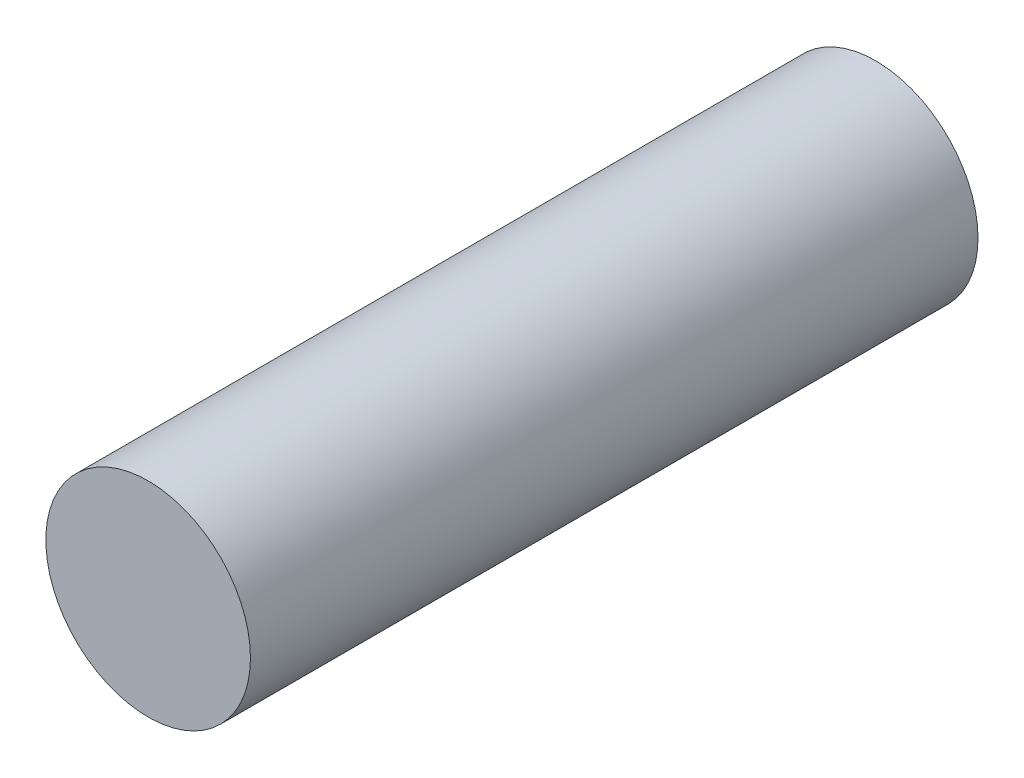
ISO-10303-21;
HEADER;
FILE_DESCRIPTION(('STEP AP214'),'2;1');
FILE_NAME('part.step','',(''),(''),'','','');
FILE_SCHEMA(('AUTOMOTIVE_DESIGN { 1 0 10303 214 1 1 1 1 }'));
ENDSEC;
DATA;
#1=APPLICATION_CONTEXT('core data for automotive mechanical design processes');
#2=APPLICATION_PROTOCOL_DEFINITION('international standard','automotive_design',2000,#1);
#3=PRODUCT_CONTEXT('',#1,'mechanical');
#4=PRODUCT('Part','Part','',(#3));
#5=PRODUCT_RELATED_PRODUCT_CATEGORY('part','',(#4));
#6=PRODUCT_DEFINITION_FORMATION('','',#4);
#7=PRODUCT_DEFINITION_CONTEXT('part definition',#1,'design');
#8=PRODUCT_DEFINITION('design','',#6,#7);
#9=PRODUCT_DEFINITION_SHAPE('','',#8);
#10=(LENGTH_UNIT() NAMED_UNIT(*) SI_UNIT(.MILLI.,.METRE.));
#11=(NAMED_UNIT(*) PLANE_ANGLE_UNIT() SI_UNIT($,.RADIAN.));
#12=(NAMED_UNIT(*) SI_UNIT($,.STERADIAN.) SOLID_ANGLE_UNIT());
#13=UNCERTAINTY_MEASURE_WITH_UNIT(LENGTH_MEASURE(1.E-05),#10,'distance_accuracy_value','');
#14=(GEOMETRIC_REPRESENTATION_CONTEXT(3) GLOBAL_UNCERTAINTY_ASSIGNED_CONTEXT((#13)) GLOBAL_UNIT_ASSIGNED_CONTEXT((#10,
#11,#12)) REPRESENTATION_CONTEXT('',''));
#15=CARTESIAN_POINT('',(0.,0.,0.));
#16=DIRECTION('',(0.,0.,1.));
#17=DIRECTION('',(1.,0.,0.));
#18=AXIS2_PLACEMENT_3D('',#15,#16,#17);
#19=CARTESIAN_POINT('',(0.,0.,-32.));
#20=DIRECTION('',(0.,0.,1.));
#21=DIRECTION('',(1.,0.,0.));
#22=AXIS2_PLACEMENT_3D('',#19,#20,#21);
#23=CYLINDRICAL_SURFACE('',#22,4.5);
#24=CARTESIAN_POINT('',(0.,0.,-32.));
#25=DIRECTION('',(0.,0.,1.));
#26=DIRECTION('',(1.,0.,0.));
#27=AXIS2_PLACEMENT_3D('',#24,#25,#26);
#28=CIRCLE('',#27,4.5);
#29=CARTESIAN_POINT('',(4.5,0.,-32.));
#30=VERTEX_POINT('',#29);
#31=EDGE_CURVE('E10',#30,#30,#28,.T.);
#32=ORIENTED_EDGE('',*,*,#31,.T.);
#33=EDGE_LOOP('',(#32));
#34=FACE_BOUND('',#33,.T.);
#35=CARTESIAN_POINT('',(0.,0.,0.));
#36=DIRECTION('',(0.,0.,1.));
#37=DIRECTION('',(1.,0.,0.));
#38=AXIS2_PLACEMENT_3D('',#35,#36,#37);
#39=CIRCLE('',#38,4.5);
#40=CARTESIAN_POINT('',(4.5,0.,0.));
#41=VERTEX_POINT('',#40);
#42=EDGE_CURVE('E40',#41,#41,#39,.T.);
#43=ORIENTED_EDGE('',*,*,#42,.F.);
#44=EDGE_LOOP('',(#43));
#45=FACE_BOUND('',#44,.T.);
#46=ADVANCED_FACE('F37',(#34,#45),#23,.T.);
#47=CARTESIAN_POINT('',(0.,0.,-32.));
#48=DIRECTION('',(0.,0.,1.));
#49=DIRECTION('',(1.,0.,0.));
#50=AXIS2_PLACEMENT_3D('',#47,#48,#49);
#51=PLANE('',#50);
#52=ORIENTED_EDGE('',*,*,#31,.F.);
#53=EDGE_LOOP('',(#52));
#54=FACE_BOUND('',#53,.T.);
#55=ADVANCED_FACE('F52',(#54),#51,.F.);
#56=CARTESIAN_POINT('',(0.,0.,0.));
#57=DIRECTION('',(0.,0.,1.));
#58=DIRECTION('',(1.,0.,0.));
#59=AXIS2_PLACEMENT_3D('',#56,#57,#58);
#60=PLANE('',#59);
#61=ORIENTED_EDGE('',*,*,#42,.T.);
#62=EDGE_LOOP('',(#61));
#63=FACE_BOUND('',#62,.T.);
#64=ADVANCED_FACE('F49',(#63),#60,.T.);
#65=CLOSED_SHELL('',(#46,#55,#64));
#66=MANIFOLD_SOLID_BREP('B2',#65);
#67=ADVANCED_BREP_SHAPE_REPRESENTATION('',(#18,#66),#14);
#68=SHAPE_DEFINITION_REPRESENTATION(#9,#67);
ENDSEC;
END-ISO-10303-21;
